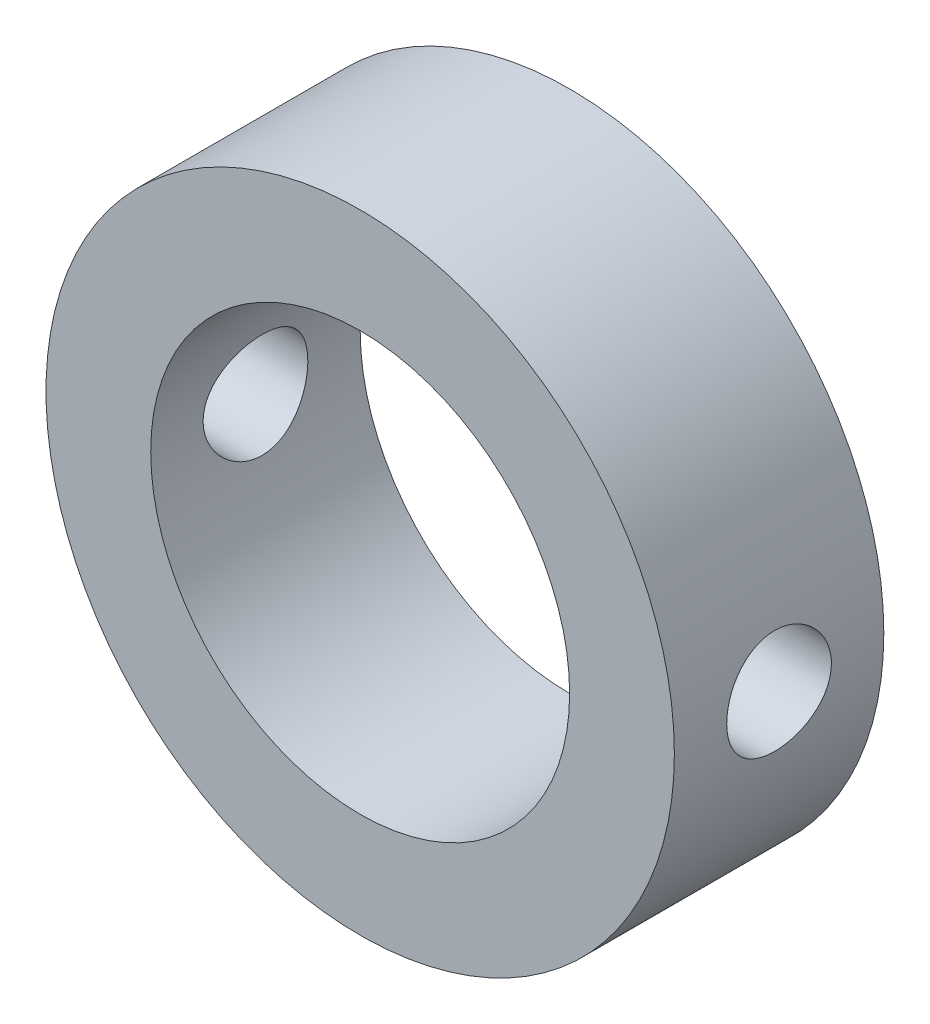
ISO-10303-21;
HEADER;
FILE_DESCRIPTION(('STEP AP214'),'2;1');
FILE_NAME('part.step','',(''),(''),'','','');
FILE_SCHEMA(('AUTOMOTIVE_DESIGN { 1 0 10303 214 1 1 1 1 }'));
ENDSEC;
DATA;
#1=APPLICATION_CONTEXT('core data for automotive mechanical design processes');
#2=APPLICATION_PROTOCOL_DEFINITION('international standard','automotive_design',2000,#1);
#3=PRODUCT_CONTEXT('',#1,'mechanical');
#4=PRODUCT('Part','Part','',(#3));
#5=PRODUCT_RELATED_PRODUCT_CATEGORY('part','',(#4));
#6=PRODUCT_DEFINITION_FORMATION('','',#4);
#7=PRODUCT_DEFINITION_CONTEXT('part definition',#1,'design');
#8=PRODUCT_DEFINITION('design','',#6,#7);
#9=PRODUCT_DEFINITION_SHAPE('','',#8);
#10=(LENGTH_UNIT() NAMED_UNIT(*) SI_UNIT(.MILLI.,.METRE.));
#11=(NAMED_UNIT(*) PLANE_ANGLE_UNIT() SI_UNIT($,.RADIAN.));
#12=(NAMED_UNIT(*) SI_UNIT($,.STERADIAN.) SOLID_ANGLE_UNIT());
#13=UNCERTAINTY_MEASURE_WITH_UNIT(LENGTH_MEASURE(1.E-05),#10,'distance_accuracy_value','');
#14=(GEOMETRIC_REPRESENTATION_CONTEXT(3) GLOBAL_UNCERTAINTY_ASSIGNED_CONTEXT((#13)) GLOBAL_UNIT_ASSIGNED_CONTEXT((#10,
#11,#12)) REPRESENTATION_CONTEXT('',''));
#15=CARTESIAN_POINT('',(0.,0.,0.));
#16=DIRECTION('',(0.,0.,1.));
#17=DIRECTION('',(1.,0.,0.));
#18=AXIS2_PLACEMENT_3D('',#15,#16,#17);
#19=CARTESIAN_POINT('',(0.,0.,8.));
#20=DIRECTION('',(0.,0.,1.));
#21=DIRECTION('',(1.,0.,0.));
#22=AXIS2_PLACEMENT_3D('',#19,#20,#21);
#23=PLANE('',#22);
#24=CARTESIAN_POINT('',(0.,0.,8.));
#25=DIRECTION('',(0.,0.,1.));
#26=DIRECTION('',(1.,0.,0.));
#27=AXIS2_PLACEMENT_3D('',#24,#25,#26);
#28=CIRCLE('',#27,12.);
#29=CARTESIAN_POINT('',(12.,0.,8.));
#30=VERTEX_POINT('',#29);
#31=EDGE_CURVE('E10',#30,#30,#28,.T.);
#32=ORIENTED_EDGE('',*,*,#31,.T.);
#33=EDGE_LOOP('',(#32));
#34=FACE_BOUND('',#33,.T.);
#35=CARTESIAN_POINT('',(0.,0.,8.));
#36=DIRECTION('',(0.,0.,1.));
#37=DIRECTION('',(1.,0.,0.));
#38=AXIS2_PLACEMENT_3D('',#35,#36,#37);
#39=CIRCLE('',#38,8.);
#40=CARTESIAN_POINT('',(8.,0.,8.));
#41=VERTEX_POINT('',#40);
#42=EDGE_CURVE('E58',#41,#41,#39,.T.);
#43=ORIENTED_EDGE('',*,*,#42,.F.);
#44=EDGE_LOOP('',(#43));
#45=FACE_BOUND('',#44,.T.);
#46=ADVANCED_FACE('F37',(#34,#45),#23,.T.);
#47=CARTESIAN_POINT('',(0.,0.,0.));
#48=DIRECTION('',(0.,0.,1.));
#49=DIRECTION('',(1.,0.,0.));
#50=AXIS2_PLACEMENT_3D('',#47,#48,#49);
#51=PLANE('',#50);
#52=CARTESIAN_POINT('',(0.,0.,0.));
#53=DIRECTION('',(0.,0.,1.));
#54=DIRECTION('',(1.,0.,0.));
#55=AXIS2_PLACEMENT_3D('',#52,#53,#54);
#56=CIRCLE('',#55,12.);
#57=CARTESIAN_POINT('',(12.,0.,0.));
#58=VERTEX_POINT('',#57);
#59=EDGE_CURVE('E52',#58,#58,#56,.T.);
#60=ORIENTED_EDGE('',*,*,#59,.F.);
#61=EDGE_LOOP('',(#60));
#62=FACE_BOUND('',#61,.T.);
#63=CARTESIAN_POINT('',(0.,0.,0.));
#64=DIRECTION('',(0.,0.,1.));
#65=DIRECTION('',(1.,0.,0.));
#66=AXIS2_PLACEMENT_3D('',#63,#64,#65);
#67=CIRCLE('',#66,8.);
#68=CARTESIAN_POINT('',(8.,0.,0.));
#69=VERTEX_POINT('',#68);
#70=EDGE_CURVE('E61',#69,#69,#67,.T.);
#71=ORIENTED_EDGE('',*,*,#70,.T.);
#72=EDGE_LOOP('',(#71));
#73=FACE_BOUND('',#72,.T.);
#74=ADVANCED_FACE('F102',(#62,#73),#51,.F.);
#75=CARTESIAN_POINT('',(0.,0.,8.));
#76=DIRECTION('',(0.,0.,-1.));
#77=DIRECTION('',(-1.,0.,0.));
#78=AXIS2_PLACEMENT_3D('',#75,#76,#77);
#79=CYLINDRICAL_SURFACE('',#78,12.);
#80=CARTESIAN_POINT('',(-12.,0.,6.));
#81=CARTESIAN_POINT('',(-11.9999980893506,-0.111512723966572,5.99999552884175));
#82=CARTESIAN_POINT('',(-11.9984294233043,-0.223086305471057,5.99064218002486));
#83=CARTESIAN_POINT('',(-11.9923227595311,-0.443104177338434,5.95349147298774));
#84=CARTESIAN_POINT('',(-11.9877820313911,-0.551545494367398,5.92567715447072));
#85=CARTESIAN_POINT('',(-11.9762405458916,-0.762083797770115,5.8524676411258));
#86=CARTESIAN_POINT('',(-11.9692418012735,-0.86418589474552,5.80708682748754));
#87=CARTESIAN_POINT('',(-11.9535538166566,-1.05931347358236,5.70007016635808));
#88=CARTESIAN_POINT('',(-11.9448647700355,-1.15233999190287,5.6384361780136));
#89=CARTESIAN_POINT('',(-11.9266665396665,-1.32757809143334,5.50003593294363));
#90=CARTESIAN_POINT('',(-11.9171509745189,-1.40969032282797,5.4231447082911));
#91=CARTESIAN_POINT('',(-11.8984210150139,-1.55991079892794,5.25668162522175));
#92=CARTESIAN_POINT('',(-11.8892066397013,-1.62801815951278,5.16710896683471));
#93=CARTESIAN_POINT('',(-11.8720605260782,-1.74869370048411,4.97714322704236));
#94=CARTESIAN_POINT('',(-11.8641370327331,-1.8011636422888,4.8766869305562));
#95=CARTESIAN_POINT('',(-11.8505583183574,-1.88844669232898,4.6682323485595));
#96=CARTESIAN_POINT('',(-11.8449029441145,-1.92326099325249,4.56023457305789));
#97=CARTESIAN_POINT('',(-11.836564294742,-1.97393150222785,4.34081578011477));
#98=CARTESIAN_POINT('',(-11.8338541478856,-1.98995922330832,4.22943541079889));
#99=CARTESIAN_POINT('',(-11.8316315114932,-2.0031333802319,4.00553577849322));
#100=CARTESIAN_POINT('',(-11.8321187956577,-2.0002811523112,3.89301659666616));
#101=CARTESIAN_POINT('',(-11.8362114309084,-1.97591607871692,3.67125771097964));
#102=CARTESIAN_POINT('',(-11.8397845865513,-1.95459590551182,3.56199615716381));
#103=CARTESIAN_POINT('',(-11.8495959616881,-1.89420251232276,3.34862294573669));
#104=CARTESIAN_POINT('',(-11.8558342725862,-1.85512868345579,3.24451146488916));
#105=CARTESIAN_POINT('',(-11.8703078346728,-1.76014179687513,3.04381694124726));
#106=CARTESIAN_POINT('',(-11.8785525368586,-1.70414873110377,2.94727247513502));
#107=CARTESIAN_POINT('',(-11.8961033473201,-1.57696961404595,2.76487647956929));
#108=CARTESIAN_POINT('',(-11.9054095412343,-1.50578233652343,2.67902581403605));
#109=CARTESIAN_POINT('',(-11.9241762230383,-1.34918576972724,2.51933913135412));
#110=CARTESIAN_POINT('',(-11.9336371938532,-1.2636111710985,2.44566518516793));
#111=CARTESIAN_POINT('',(-11.9515408111738,-1.08122819918532,2.31369778986773));
#112=CARTESIAN_POINT('',(-11.959983451118,-0.984419753525138,2.25540443985342));
#113=CARTESIAN_POINT('',(-11.9749111431433,-0.78216473293337,2.15583821829097));
#114=CARTESIAN_POINT('',(-11.9813945472596,-0.676710980451729,2.11457966453499));
#115=CARTESIAN_POINT('',(-11.9916600241013,-0.460238676482186,2.05040462780322));
#116=CARTESIAN_POINT('',(-11.9954423228038,-0.349220591343575,2.02748661042103));
#117=CARTESIAN_POINT('',(-11.9998490387415,-0.1261679210413,2.00086291323109));
#118=CARTESIAN_POINT('',(-12.0005100241023,-0.0141605897208097,1.99693474255551));
#119=CARTESIAN_POINT('',(-11.9986997953694,0.208911818311909,2.0078090755425));
#120=CARTESIAN_POINT('',(-11.9962287017929,0.319976931113631,2.02261085850699));
#121=CARTESIAN_POINT('',(-11.9884546155056,0.53732494043741,2.07033987946838));
#122=CARTESIAN_POINT('',(-11.9831688384105,0.643632694708303,2.1031569667121));
#123=CARTESIAN_POINT('',(-11.9703557156429,0.849237507888354,2.18586761455963));
#124=CARTESIAN_POINT('',(-11.9628282440962,0.948534172727775,2.23576213410822));
#125=CARTESIAN_POINT('',(-11.9462761304193,1.13826455157517,2.35172089975743));
#126=CARTESIAN_POINT('',(-11.9372388470962,1.22861220074972,2.4179241249338));
#127=CARTESIAN_POINT('',(-11.9187077391352,1.39699486840215,2.56442985230805));
#128=CARTESIAN_POINT('',(-11.9092138813724,1.47502899175727,2.64473337862133));
#129=CARTESIAN_POINT('',(-11.8907214018868,1.6173942237264,2.81815803845714));
#130=CARTESIAN_POINT('',(-11.8817289290968,1.68157500889097,2.91140333241153));
#131=CARTESIAN_POINT('',(-11.8653722382231,1.79336184823599,3.10748237531083));
#132=CARTESIAN_POINT('',(-11.8580079685282,1.84096842781586,3.210315820182));
#133=CARTESIAN_POINT('',(-11.8457876295816,1.91803066517852,3.4222317862497));
#134=CARTESIAN_POINT('',(-11.8409212344885,1.94756114603836,3.53128647602439));
#135=CARTESIAN_POINT('',(-11.8342217346821,1.98786836302262,3.75289610337741));
#136=CARTESIAN_POINT('',(-11.8323883662618,1.99864672955694,3.86545073578564));
#137=CARTESIAN_POINT('',(-11.8319738646721,2.00109829283788,4.08936413276993));
#138=CARTESIAN_POINT('',(-11.8333524520452,1.99300810890015,4.20072030286023));
#139=CARTESIAN_POINT('',(-11.8391182516298,1.95846387116548,4.42046339844061));
#140=CARTESIAN_POINT('',(-11.8435054540897,1.93200987688998,4.5288503335535));
#141=CARTESIAN_POINT('',(-11.8547788502538,1.86157959167592,4.73948674983409));
#142=CARTESIAN_POINT('',(-11.8616621377574,1.81762367248035,4.84174320804482));
#143=CARTESIAN_POINT('',(-11.8771549513777,1.71346160313273,5.03746853535588));
#144=CARTESIAN_POINT('',(-11.8857645631072,1.65325464699885,5.13093696829771));
#145=CARTESIAN_POINT('',(-11.903867632365,1.51745510749773,5.3076284664862));
#146=CARTESIAN_POINT('',(-11.9133703646104,1.44168845087492,5.39071681336022));
#147=CARTESIAN_POINT('',(-11.9321149788867,1.27728722510419,5.54308128357995));
#148=CARTESIAN_POINT('',(-11.9413568002124,1.18864969033011,5.61235421491054));
#149=CARTESIAN_POINT('',(-11.9586122371378,1.00029533571223,5.73555861455996));
#150=CARTESIAN_POINT('',(-11.9666169300248,0.900506230026256,5.78938083145036));
#151=CARTESIAN_POINT('',(-11.9804093408142,0.693210455503186,5.87941558768794));
#152=CARTESIAN_POINT('',(-11.9861992654199,0.585711595864009,5.91564566486376));
#153=CARTESIAN_POINT('',(-11.9936463266636,0.398162648036321,5.96160421930133));
#154=CARTESIAN_POINT('',(-11.9960162181869,0.319247064238758,5.97597957569277));
#155=CARTESIAN_POINT('',(-11.999193727889,0.160231448255847,5.9951789902758));
#156=CARTESIAN_POINT('',(-12.0000013729651,0.0801314364867954,6.00000321290989));
#157=CARTESIAN_POINT('',(-12.,0.,6.));
#158=B_SPLINE_CURVE_WITH_KNOTS('',3,(#80,#81,#82,#83,#84,#85,#86,#87,#88,#89,#90,#91,#92,#93,
#94,#95,#96,#97,#98,#99,#100,#101,#102,#103,#104,#105,#106,#107,#108,#109,#110,#111,#112,#113,
#114,#115,#116,#117,#118,#119,#120,#121,#122,#123,#124,#125,#126,#127,#128,#129,#130,#131,#132,
#133,#134,#135,#136,#137,#138,#139,#140,#141,#142,#143,#144,#145,#146,#147,#148,#149,#150,#151,
#152,#153,#154,#155,#156,#157),.UNSPECIFIED.,.T.,.F.,(4,2,2,2,2,2,2,2,2,2,2,2,2,2,2,2,2,2,2,2,2,
2,2,2,2,2,2,2,2,2,2,2,2,2,2,2,2,2,4),(0.,0.334245267950808,0.668798036556336,1.00307749362022,
1.33731873013983,1.67441992849866,2.01154240135885,2.35074016659072,2.68991501500945,
3.02596861682739,3.36199843456709,3.69456417408327,4.02714132020305,4.36131645306046,
4.69551856544459,5.03386215929061,5.37220793308678,5.71083751132723,6.04943875616919,
6.38406306793118,6.71867450428688,7.05126245605132,7.38386908660853,7.71941460501619,
8.05498450443426,8.39403057606095,8.73306589900754,9.07068817873417,9.40828110229294,
9.7416632761816,10.0750443695051,10.4080385458098,10.7410492402347,11.0780110735471,
11.4150506710318,11.7544178528576,12.0934460170406,12.3336339853121,12.5738178182157),.UNSPECIFIED.);
#159=CARTESIAN_POINT('',(-12.,0.,6.));
#160=VERTEX_POINT('',#159);
#161=EDGE_CURVE('E88',#160,#160,#158,.T.);
#162=ORIENTED_EDGE('',*,*,#161,.T.);
#163=EDGE_LOOP('',(#162));
#164=FACE_BOUND('',#163,.T.);
#165=CARTESIAN_POINT('',(12.,0.,2.));
#166=CARTESIAN_POINT('',(11.9999980893506,-0.111512723966572,2.00000447115825));
#167=CARTESIAN_POINT('',(11.9984294233043,-0.223086305471057,2.00935781997514));
#168=CARTESIAN_POINT('',(11.9923227595311,-0.443104177338434,2.04650852701226));
#169=CARTESIAN_POINT('',(11.9877820313911,-0.551545494367398,2.07432284552928));
#170=CARTESIAN_POINT('',(11.9762405458916,-0.762083797770115,2.1475323588742));
#171=CARTESIAN_POINT('',(11.9692418012735,-0.864185894745521,2.19291317251246));
#172=CARTESIAN_POINT('',(11.9535538166566,-1.05931347358236,2.29992983364192));
#173=CARTESIAN_POINT('',(11.9448647700355,-1.15233999190287,2.3615638219864));
#174=CARTESIAN_POINT('',(11.9266665396665,-1.32757809143334,2.49996406705637));
#175=CARTESIAN_POINT('',(11.9171509745189,-1.40969032282797,2.5768552917089));
#176=CARTESIAN_POINT('',(11.8984210150139,-1.55991079892794,2.74331837477825));
#177=CARTESIAN_POINT('',(11.8892066397013,-1.62801815951278,2.83289103316529));
#178=CARTESIAN_POINT('',(11.8720605260782,-1.74869370048411,3.02285677295764));
#179=CARTESIAN_POINT('',(11.8641370327331,-1.8011636422888,3.1233130694438));
#180=CARTESIAN_POINT('',(11.8505583183574,-1.88844669232898,3.3317676514405));
#181=CARTESIAN_POINT('',(11.8449029441145,-1.92326099325249,3.43976542694211));
#182=CARTESIAN_POINT('',(11.836564294742,-1.97393150222785,3.65918421988523));
#183=CARTESIAN_POINT('',(11.8338541478856,-1.98995922330832,3.77056458920111));
#184=CARTESIAN_POINT('',(11.8316315114932,-2.0031333802319,3.99446422150678));
#185=CARTESIAN_POINT('',(11.8321187956577,-2.0002811523112,4.10698340333384));
#186=CARTESIAN_POINT('',(11.8362114309084,-1.97591607871692,4.32874228902036));
#187=CARTESIAN_POINT('',(11.8397845865513,-1.95459590551182,4.43800384283619));
#188=CARTESIAN_POINT('',(11.8495959616881,-1.89420251232276,4.65137705426331));
#189=CARTESIAN_POINT('',(11.8558342725862,-1.85512868345579,4.75548853511084));
#190=CARTESIAN_POINT('',(11.8703078346728,-1.76014179687513,4.95618305875274));
#191=CARTESIAN_POINT('',(11.8785525368586,-1.70414873110377,5.05272752486498));
#192=CARTESIAN_POINT('',(11.8961033473201,-1.57696961404595,5.23512352043071));
#193=CARTESIAN_POINT('',(11.9054095412343,-1.50578233652343,5.32097418596395));
#194=CARTESIAN_POINT('',(11.9241762230383,-1.34918576972724,5.48066086864588));
#195=CARTESIAN_POINT('',(11.9336371938532,-1.2636111710985,5.55433481483207));
#196=CARTESIAN_POINT('',(11.9515408111738,-1.08122819918532,5.68630221013227));
#197=CARTESIAN_POINT('',(11.959983451118,-0.984419753525138,5.74459556014658));
#198=CARTESIAN_POINT('',(11.9749111431433,-0.782164732933369,5.84416178170903));
#199=CARTESIAN_POINT('',(11.9813945472596,-0.676710980451729,5.885420335465));
#200=CARTESIAN_POINT('',(11.9916600241013,-0.460238676482184,5.94959537219678));
#201=CARTESIAN_POINT('',(11.9954423228038,-0.349220591343574,5.97251338957897));
#202=CARTESIAN_POINT('',(11.9998490387415,-0.126167921041298,5.99913708676891));
#203=CARTESIAN_POINT('',(12.0005100241023,-0.0141605897208083,6.00306525744449));
#204=CARTESIAN_POINT('',(11.9986997953694,0.208911818311911,5.9921909244575));
#205=CARTESIAN_POINT('',(11.9962287017929,0.319976931113632,5.97738914149301));
#206=CARTESIAN_POINT('',(11.9884546155056,0.537324940437412,5.92966012053162));
#207=CARTESIAN_POINT('',(11.9831688384105,0.643632694708305,5.8968430332879));
#208=CARTESIAN_POINT('',(11.9703557156429,0.849237507888355,5.81413238544037));
#209=CARTESIAN_POINT('',(11.9628282440962,0.948534172727776,5.76423786589178));
#210=CARTESIAN_POINT('',(11.9462761304193,1.13826455157517,5.64827910024257));
#211=CARTESIAN_POINT('',(11.9372388470962,1.22861220074972,5.5820758750662));
#212=CARTESIAN_POINT('',(11.9187077391352,1.39699486840215,5.43557014769195));
#213=CARTESIAN_POINT('',(11.9092138813724,1.47502899175727,5.35526662137866));
#214=CARTESIAN_POINT('',(11.8907214018868,1.6173942237264,5.18184196154286));
#215=CARTESIAN_POINT('',(11.8817289290968,1.68157500889097,5.08859666758847));
#216=CARTESIAN_POINT('',(11.8653722382231,1.79336184823599,4.89251762468917));
#217=CARTESIAN_POINT('',(11.8580079685282,1.84096842781586,4.789684179818));
#218=CARTESIAN_POINT('',(11.8457876295816,1.91803066517852,4.57776821375029));
#219=CARTESIAN_POINT('',(11.8409212344885,1.94756114603836,4.46871352397561));
#220=CARTESIAN_POINT('',(11.8342217346821,1.98786836302262,4.24710389662259));
#221=CARTESIAN_POINT('',(11.8323883662618,1.99864672955694,4.13454926421436));
#222=CARTESIAN_POINT('',(11.8319738646721,2.00109829283788,3.91063586723007));
#223=CARTESIAN_POINT('',(11.8333524520452,1.99300810890015,3.79927969713977));
#224=CARTESIAN_POINT('',(11.8391182516298,1.95846387116548,3.57953660155939));
#225=CARTESIAN_POINT('',(11.8435054540897,1.93200987688998,3.4711496664465));
#226=CARTESIAN_POINT('',(11.8547788502538,1.86157959167592,3.26051325016591));
#227=CARTESIAN_POINT('',(11.8616621377574,1.81762367248035,3.15825679195518));
#228=CARTESIAN_POINT('',(11.8771549513777,1.71346160313273,2.96253146464412));
#229=CARTESIAN_POINT('',(11.8857645631072,1.65325464699885,2.86906303170229));
#230=CARTESIAN_POINT('',(11.903867632365,1.51745510749772,2.6923715335138));
#231=CARTESIAN_POINT('',(11.9133703646104,1.44168845087492,2.60928318663978));
#232=CARTESIAN_POINT('',(11.9321149788867,1.27728722510418,2.45691871642005));
#233=CARTESIAN_POINT('',(11.9413568002124,1.18864969033011,2.38764578508946));
#234=CARTESIAN_POINT('',(11.9586122371378,1.00029533571222,2.26444138544004));
#235=CARTESIAN_POINT('',(11.9666169300248,0.900506230026254,2.21061916854964));
#236=CARTESIAN_POINT('',(11.9804093408142,0.693210455503184,2.12058441231206));
#237=CARTESIAN_POINT('',(11.9861992654199,0.585711595864007,2.08435433513624));
#238=CARTESIAN_POINT('',(11.9936463266636,0.398162648036319,2.03839578069867));
#239=CARTESIAN_POINT('',(11.9960162181869,0.319247064238756,2.02402042430723));
#240=CARTESIAN_POINT('',(11.999193727889,0.160231448255846,2.0048210097242));
#241=CARTESIAN_POINT('',(12.0000013729651,0.0801314364867947,1.99999678709011));
#242=CARTESIAN_POINT('',(12.,0.,2.));
#243=B_SPLINE_CURVE_WITH_KNOTS('',3,(#165,#166,#167,#168,#169,#170,#171,#172,#173,#174,#175,
#176,#177,#178,#179,#180,#181,#182,#183,#184,#185,#186,#187,#188,#189,#190,#191,#192,#193,#194,
#195,#196,#197,#198,#199,#200,#201,#202,#203,#204,#205,#206,#207,#208,#209,#210,#211,#212,#213,
#214,#215,#216,#217,#218,#219,#220,#221,#222,#223,#224,#225,#226,#227,#228,#229,#230,#231,#232,
#233,#234,#235,#236,#237,#238,#239,#240,#241,#242),.UNSPECIFIED.,.T.,.F.,(4,2,2,2,2,2,2,2,2,2,2,
2,2,2,2,2,2,2,2,2,2,2,2,2,2,2,2,2,2,2,2,2,2,2,2,2,2,2,4),(0.,0.334245267950808,
0.668798036556337,1.00307749362022,1.33731873013983,1.67441992849866,2.01154240135885,
2.35074016659072,2.68991501500945,3.02596861682739,3.36199843456709,3.69456417408327,
4.02714132020305,4.36131645306046,4.69551856544459,5.03386215929061,5.37220793308678,
5.71083751132723,6.04943875616919,6.38406306793118,6.71867450428688,7.05126245605133,
7.38386908660854,7.71941460501619,8.05498450443427,8.39403057606096,8.73306589900755,
9.07068817873418,9.40828110229295,9.74166327618161,10.0750443695051,10.4080385458098,
10.7410492402347,11.0780110735471,11.4150506710318,11.7544178528576,12.0934460170406,
12.3336339853122,12.5738178182158),.UNSPECIFIED.);
#244=CARTESIAN_POINT('',(12.,0.,2.));
#245=VERTEX_POINT('',#244);
#246=EDGE_CURVE('E82',#245,#245,#243,.T.);
#247=ORIENTED_EDGE('',*,*,#246,.T.);
#248=EDGE_LOOP('',(#247));
#249=FACE_BOUND('',#248,.T.);
#250=ORIENTED_EDGE('',*,*,#31,.F.);
#251=EDGE_LOOP('',(#250));
#252=FACE_BOUND('',#251,.T.);
#253=ORIENTED_EDGE('',*,*,#59,.T.);
#254=EDGE_LOOP('',(#253));
#255=FACE_BOUND('',#254,.T.);
#256=ADVANCED_FACE('F39',(#164,#249,#252,#255),#79,.T.);
#257=CARTESIAN_POINT('',(0.,0.,8.));
#258=DIRECTION('',(0.,0.,-1.));
#259=DIRECTION('',(-1.,0.,0.));
#260=AXIS2_PLACEMENT_3D('',#257,#258,#259);
#261=CYLINDRICAL_SURFACE('',#260,8.);
#262=CARTESIAN_POINT('',(-8.,0.,6.));
#263=CARTESIAN_POINT('',(-7.9999981315735,-0.110501451559642,5.99999689901579));
#264=CARTESIAN_POINT('',(-7.99768770842435,-0.221037543774351,5.99081126563495));
#265=CARTESIAN_POINT('',(-7.98869485106526,-0.438941765027377,5.95436646492399));
#266=CARTESIAN_POINT('',(-7.98200993893301,-0.546308062494319,5.92709705394953));
#267=CARTESIAN_POINT('',(-7.96500835109376,-0.754694496243436,5.85541432871722));
#268=CARTESIAN_POINT('',(-7.95469603789411,-0.855722084573336,5.81102160171297));
#269=CARTESIAN_POINT('',(-7.93153791743495,-1.04889617587257,5.70642481327354));
#270=CARTESIAN_POINT('',(-7.91869202472209,-1.14104237913168,5.64622021850804));
#271=CARTESIAN_POINT('',(-7.89156551455591,-1.31573590306789,5.51039894712776));
#272=CARTESIAN_POINT('',(-7.87726276197502,-1.39807425341474,5.43451790005459));
#273=CARTESIAN_POINT('',(-7.84898160157248,-1.54899856960443,5.27006372678795));
#274=CARTESIAN_POINT('',(-7.83500323053157,-1.61758298259892,5.18148916940409));
#275=CARTESIAN_POINT('',(-7.80873034264225,-1.74003539039863,4.99253969768401));
#276=CARTESIAN_POINT('',(-7.79646392619748,-1.79366962123352,4.89200902558836));
#277=CARTESIAN_POINT('',(-7.77532659757355,-1.88319587806766,4.68300211778662));
#278=CARTESIAN_POINT('',(-7.76645514259225,-1.91909074058685,4.57452715555731));
#279=CARTESIAN_POINT('',(-7.7533396892843,-1.97140644907302,4.35500866906445));
#280=CARTESIAN_POINT('',(-7.74900654662681,-1.98820302444274,4.24406013861601));
#281=CARTESIAN_POINT('',(-7.74519149946122,-2.00301570008855,4.02084190800087));
#282=CARTESIAN_POINT('',(-7.74570880570571,-2.00103485575748,3.90857242574382));
#283=CARTESIAN_POINT('',(-7.75145607355756,-1.97864869951961,3.6887789230062));
#284=CARTESIAN_POINT('',(-7.75657150676391,-1.95869112025418,3.58120583804623));
#285=CARTESIAN_POINT('',(-7.77075612894758,-1.90163224920399,3.37098526545192));
#286=CARTESIAN_POINT('',(-7.77982559958985,-1.86452973609252,3.26833812929477));
#287=CARTESIAN_POINT('',(-7.80100151874212,-1.77385263724958,3.06968264499716));
#288=CARTESIAN_POINT('',(-7.81313769959755,-1.72011555631056,2.97375177094724));
#289=CARTESIAN_POINT('',(-7.83906281127988,-1.59780836801993,2.79210838699091));
#290=CARTESIAN_POINT('',(-7.85285203112837,-1.52923566507845,2.70639766924366));
#291=CARTESIAN_POINT('',(-7.88101174053188,-1.37688456624163,2.54506184574079));
#292=CARTESIAN_POINT('',(-7.89538759304001,-1.29272834422115,2.46979401325153));
#293=CARTESIAN_POINT('',(-7.92274620771675,-1.11281589000493,2.3343716767148));
#294=CARTESIAN_POINT('',(-7.93572892732543,-1.01705930361059,2.27421763431525));
#295=CARTESIAN_POINT('',(-7.9589030945892,-0.816154518241856,2.17059921836749));
#296=CARTESIAN_POINT('',(-7.96908480170303,-0.710975190944832,2.12719287966076));
#297=CARTESIAN_POINT('',(-7.98543889321888,-0.494501344190511,2.05877692572057));
#298=CARTESIAN_POINT('',(-7.99161204452374,-0.383207998867313,2.03376379144248));
#299=CARTESIAN_POINT('',(-7.999139990285,-0.160719960520036,2.00338991258822));
#300=CARTESIAN_POINT('',(-8.00061404677705,-0.0495956266509468,1.9975426318996));
#301=CARTESIAN_POINT('',(-7.99891739752601,0.172043833068677,2.00433200274065));
#302=CARTESIAN_POINT('',(-7.99574710989128,0.282559012859459,2.01696699039884));
#303=CARTESIAN_POINT('',(-7.98519441503143,0.498152358368655,2.05996121118851));
#304=CARTESIAN_POINT('',(-7.97787512247748,0.603286825291673,2.09005501796932));
#305=CARTESIAN_POINT('',(-7.95984942178845,0.807009723270015,2.16680944537126));
#306=CARTESIAN_POINT('',(-7.94914267159856,0.905597492043512,2.21347173908423));
#307=CARTESIAN_POINT('',(-7.92524410568414,1.0953641792398,2.3229815051663));
#308=CARTESIAN_POINT('',(-7.91201156489243,1.18638058911444,2.38610148319568));
#309=CARTESIAN_POINT('',(-7.88459345583226,1.35670215152433,2.52638654506263));
#310=CARTESIAN_POINT('',(-7.87040772335606,1.43600527863068,2.60355405282254));
#311=CARTESIAN_POINT('',(-7.84225275947695,1.58265409076364,2.77200261445928));
#312=CARTESIAN_POINT('',(-7.82829738916375,1.64965849016271,2.86358360400323));
#313=CARTESIAN_POINT('',(-7.80257171169652,1.7673476786836,3.05697684595429));
#314=CARTESIAN_POINT('',(-7.79080130756035,1.81803319221058,3.15878864394634));
#315=CARTESIAN_POINT('',(-7.77090792979553,1.90126856081239,3.3692076298841));
#316=CARTESIAN_POINT('',(-7.76276340389207,1.93392586220542,3.47777017112534));
#317=CARTESIAN_POINT('',(-7.75102325453578,1.98046087993837,3.69907951718548));
#318=CARTESIAN_POINT('',(-7.74742663626581,1.99434270330488,3.81182540137665));
#319=CARTESIAN_POINT('',(-7.74526534938609,2.00271812044533,4.03482803180694));
#320=CARTESIAN_POINT('',(-7.74655910304352,1.99775719704016,4.14506324683297));
#321=CARTESIAN_POINT('',(-7.7537054534379,1.96983637108382,4.36307185155731));
#322=CARTESIAN_POINT('',(-7.75955795855809,1.94687683024903,4.47084529068487));
#323=CARTESIAN_POINT('',(-7.77508347576963,1.88390842592373,4.68027794542054));
#324=CARTESIAN_POINT('',(-7.78473353648412,1.84400187290717,4.78196974032028));
#325=CARTESIAN_POINT('',(-7.80677007633105,1.74835321814009,4.97728717695158));
#326=CARTESIAN_POINT('',(-7.81915693494364,1.69260892004559,5.07091169758255));
#327=CARTESIAN_POINT('',(-7.84567512351349,1.56515699818285,5.25007283866936));
#328=CARTESIAN_POINT('',(-7.85984353109009,1.49307088388301,5.33533476456528));
#329=CARTESIAN_POINT('',(-7.88810702995047,1.33571916158632,5.49272939306054));
#330=CARTESIAN_POINT('',(-7.90220210302746,1.2504504283482,5.56485897348396));
#331=CARTESIAN_POINT('',(-7.92903540863551,1.06729011560345,5.69521507808614));
#332=CARTESIAN_POINT('',(-7.94174444487824,0.96919789642185,5.75316615156211));
#333=CARTESIAN_POINT('',(-7.96406566633491,0.764354746013969,5.85166328392071));
#334=CARTESIAN_POINT('',(-7.97368006933042,0.65761008458232,5.89222181419805));
#335=CARTESIAN_POINT('',(-7.98730746087389,0.459213670991296,5.94876244043954));
#336=CARTESIAN_POINT('',(-7.9920344673692,0.368506894544092,5.96793499073791));
#337=CARTESIAN_POINT('',(-7.99838140309264,0.185208095381712,5.99355459149592));
#338=CARTESIAN_POINT('',(-8.00000156601192,0.0926162149901555,6.00000259907373));
#339=CARTESIAN_POINT('',(-8.,0.,6.));
#340=B_SPLINE_CURVE_WITH_KNOTS('',3,(#262,#263,#264,#265,#266,#267,#268,#269,#270,#271,#272,
#273,#274,#275,#276,#277,#278,#279,#280,#281,#282,#283,#284,#285,#286,#287,#288,#289,#290,#291,
#292,#293,#294,#295,#296,#297,#298,#299,#300,#301,#302,#303,#304,#305,#306,#307,#308,#309,#310,
#311,#312,#313,#314,#315,#316,#317,#318,#319,#320,#321,#322,#323,#324,#325,#326,#327,#328,#329,
#330,#331,#332,#333,#334,#335,#336,#337,#338,#339),.UNSPECIFIED.,.T.,.F.,(4,2,2,2,2,2,2,2,2,2,2,
2,2,2,2,2,2,2,2,2,2,2,2,2,2,2,2,2,2,2,2,2,2,2,2,2,2,2,4),(0.,0.33116494996252,0.662517650351866,
0.993473203048141,1.32443992022577,1.66152580582852,1.99864972773416,2.34078196727743,
2.68285948225825,3.01808393468093,3.3532538415469,3.68029996013785,4.00736937959146,
4.337740371696,4.66816921119311,5.00802001296453,5.34788119415424,5.6889097201658,
6.02987298255951,6.36211078603463,6.69431868154751,7.02160366023144,7.34892169767481,
7.68204783424897,8.01523150681786,8.35659345610395,8.69794025003772,9.03723006156476,
9.37644564340971,9.70591707202578,10.0353818794581,10.3628853408369,10.6904342418696,
11.0265276855097,11.3627009303165,11.7049624733721,12.0469781843289,12.3245632392729,
12.6021274139515),.UNSPECIFIED.);
#341=CARTESIAN_POINT('',(-8.,0.,6.));
#342=VERTEX_POINT('',#341);
#343=EDGE_CURVE('E42',#342,#342,#340,.T.);
#344=ORIENTED_EDGE('',*,*,#343,.F.);
#345=EDGE_LOOP('',(#344));
#346=FACE_BOUND('',#345,.T.);
#347=CARTESIAN_POINT('',(8.,0.,2.));
#348=CARTESIAN_POINT('',(7.9999981315735,-0.110501451559641,2.00000310098421));
#349=CARTESIAN_POINT('',(7.99768770842435,-0.221037543774351,2.00918873436505));
#350=CARTESIAN_POINT('',(7.98869485106526,-0.438941765027377,2.04563353507601));
#351=CARTESIAN_POINT('',(7.98200993893301,-0.546308062494319,2.07290294605047));
#352=CARTESIAN_POINT('',(7.96500835109376,-0.754694496243436,2.14458567128278));
#353=CARTESIAN_POINT('',(7.95469603789411,-0.855722084573336,2.18897839828703));
#354=CARTESIAN_POINT('',(7.93153791743495,-1.04889617587257,2.29357518672646));
#355=CARTESIAN_POINT('',(7.91869202472209,-1.14104237913168,2.35377978149196));
#356=CARTESIAN_POINT('',(7.89156551455591,-1.31573590306789,2.48960105287224));
#357=CARTESIAN_POINT('',(7.87726276197502,-1.39807425341474,2.56548209994541));
#358=CARTESIAN_POINT('',(7.84898160157248,-1.54899856960443,2.72993627321205));
#359=CARTESIAN_POINT('',(7.83500323053157,-1.61758298259892,2.81851083059591));
#360=CARTESIAN_POINT('',(7.80873034264225,-1.74003539039863,3.00746030231599));
#361=CARTESIAN_POINT('',(7.79646392619748,-1.79366962123352,3.10799097441164));
#362=CARTESIAN_POINT('',(7.77532659757355,-1.88319587806766,3.31699788221338));
#363=CARTESIAN_POINT('',(7.76645514259225,-1.91909074058685,3.42547284444269));
#364=CARTESIAN_POINT('',(7.7533396892843,-1.97140644907302,3.64499133093555));
#365=CARTESIAN_POINT('',(7.74900654662681,-1.98820302444274,3.75593986138399));
#366=CARTESIAN_POINT('',(7.74519149946122,-2.00301570008855,3.97915809199913));
#367=CARTESIAN_POINT('',(7.74570880570571,-2.00103485575748,4.09142757425618));
#368=CARTESIAN_POINT('',(7.75145607355756,-1.97864869951961,4.3112210769938));
#369=CARTESIAN_POINT('',(7.75657150676391,-1.95869112025418,4.41879416195377));
#370=CARTESIAN_POINT('',(7.77075612894758,-1.90163224920399,4.62901473454808));
#371=CARTESIAN_POINT('',(7.77982559958985,-1.86452973609252,4.73166187070523));
#372=CARTESIAN_POINT('',(7.80100151874212,-1.77385263724958,4.93031735500284));
#373=CARTESIAN_POINT('',(7.81313769959755,-1.72011555631056,5.02624822905276));
#374=CARTESIAN_POINT('',(7.83906281127988,-1.59780836801993,5.20789161300909));
#375=CARTESIAN_POINT('',(7.85285203112837,-1.52923566507845,5.29360233075634));
#376=CARTESIAN_POINT('',(7.88101174053188,-1.37688456624163,5.45493815425921));
#377=CARTESIAN_POINT('',(7.89538759304001,-1.29272834422115,5.53020598674847));
#378=CARTESIAN_POINT('',(7.92274620771675,-1.11281589000493,5.66562832328521));
#379=CARTESIAN_POINT('',(7.93572892732543,-1.01705930361059,5.72578236568475));
#380=CARTESIAN_POINT('',(7.9589030945892,-0.816154518241855,5.82940078163251));
#381=CARTESIAN_POINT('',(7.96908480170303,-0.71097519094483,5.87280712033924));
#382=CARTESIAN_POINT('',(7.98543889321888,-0.494501344190509,5.94122307427943));
#383=CARTESIAN_POINT('',(7.99161204452374,-0.383207998867312,5.96623620855752));
#384=CARTESIAN_POINT('',(7.999139990285,-0.160719960520035,5.99661008741178));
#385=CARTESIAN_POINT('',(8.00061404677705,-0.0495956266509452,6.0024573681004));
#386=CARTESIAN_POINT('',(7.99891739752601,0.172043833068679,5.99566799725935));
#387=CARTESIAN_POINT('',(7.99574710989128,0.282559012859461,5.98303300960116));
#388=CARTESIAN_POINT('',(7.98519441503143,0.498152358368656,5.94003878881149));
#389=CARTESIAN_POINT('',(7.97787512247748,0.603286825291673,5.90994498203068));
#390=CARTESIAN_POINT('',(7.95984942178845,0.807009723270015,5.83319055462874));
#391=CARTESIAN_POINT('',(7.94914267159856,0.905597492043513,5.78652826091577));
#392=CARTESIAN_POINT('',(7.92524410568414,1.0953641792398,5.6770184948337));
#393=CARTESIAN_POINT('',(7.91201156489243,1.18638058911444,5.61389851680432));
#394=CARTESIAN_POINT('',(7.88459345583226,1.35670215152433,5.47361345493737));
#395=CARTESIAN_POINT('',(7.87040772335606,1.43600527863068,5.39644594717746));
#396=CARTESIAN_POINT('',(7.84225275947695,1.58265409076364,5.22799738554071));
#397=CARTESIAN_POINT('',(7.82829738916375,1.64965849016271,5.13641639599677));
#398=CARTESIAN_POINT('',(7.80257171169652,1.7673476786836,4.94302315404571));
#399=CARTESIAN_POINT('',(7.79080130756035,1.81803319221058,4.84121135605366));
#400=CARTESIAN_POINT('',(7.77090792979553,1.90126856081239,4.6307923701159));
#401=CARTESIAN_POINT('',(7.76276340389207,1.93392586220542,4.52222982887465));
#402=CARTESIAN_POINT('',(7.75102325453578,1.98046087993837,4.30092048281452));
#403=CARTESIAN_POINT('',(7.74742663626581,1.99434270330488,4.18817459862335));
#404=CARTESIAN_POINT('',(7.74526534938609,2.00271812044533,3.96517196819306));
#405=CARTESIAN_POINT('',(7.74655910304351,1.99775719704016,3.85493675316703));
#406=CARTESIAN_POINT('',(7.7537054534379,1.96983637108382,3.63692814844269));
#407=CARTESIAN_POINT('',(7.75955795855809,1.94687683024903,3.52915470931513));
#408=CARTESIAN_POINT('',(7.77508347576963,1.88390842592373,3.31972205457945));
#409=CARTESIAN_POINT('',(7.78473353648412,1.84400187290717,3.21803025967972));
#410=CARTESIAN_POINT('',(7.80677007633105,1.74835321814009,3.02271282304841));
#411=CARTESIAN_POINT('',(7.81915693494364,1.69260892004558,2.92908830241744));
#412=CARTESIAN_POINT('',(7.8456751235135,1.56515699818285,2.74992716133064));
#413=CARTESIAN_POINT('',(7.85984353109009,1.49307088388301,2.66466523543472));
#414=CARTESIAN_POINT('',(7.88810702995048,1.33571916158631,2.50727060693946));
#415=CARTESIAN_POINT('',(7.90220210302746,1.25045042834819,2.43514102651604));
#416=CARTESIAN_POINT('',(7.92903540863551,1.06729011560345,2.30478492191386));
#417=CARTESIAN_POINT('',(7.94174444487824,0.969197896421848,2.24683384843789));
#418=CARTESIAN_POINT('',(7.96406566633491,0.764354746013967,2.14833671607929));
#419=CARTESIAN_POINT('',(7.97368006933042,0.657610084582318,2.10777818580195));
#420=CARTESIAN_POINT('',(7.98730746087389,0.459213670991295,2.05123755956046));
#421=CARTESIAN_POINT('',(7.9920344673692,0.368506894544091,2.03206500926209));
#422=CARTESIAN_POINT('',(7.99838140309264,0.185208095381711,2.00644540850408));
#423=CARTESIAN_POINT('',(8.00000156601192,0.0926162149901549,1.99999740092626));
#424=CARTESIAN_POINT('',(8.,0.,2.));
#425=B_SPLINE_CURVE_WITH_KNOTS('',3,(#347,#348,#349,#350,#351,#352,#353,#354,#355,#356,#357,
#358,#359,#360,#361,#362,#363,#364,#365,#366,#367,#368,#369,#370,#371,#372,#373,#374,#375,#376,
#377,#378,#379,#380,#381,#382,#383,#384,#385,#386,#387,#388,#389,#390,#391,#392,#393,#394,#395,
#396,#397,#398,#399,#400,#401,#402,#403,#404,#405,#406,#407,#408,#409,#410,#411,#412,#413,#414,
#415,#416,#417,#418,#419,#420,#421,#422,#423,#424),.UNSPECIFIED.,.T.,.F.,(4,2,2,2,2,2,2,2,2,2,2,
2,2,2,2,2,2,2,2,2,2,2,2,2,2,2,2,2,2,2,2,2,2,2,2,2,2,2,4),(0.,0.33116494996252,0.662517650351866,
0.993473203048141,1.32443992022577,1.66152580582852,1.99864972773416,2.34078196727742,
2.68285948225824,3.01808393468093,3.3532538415469,3.68029996013785,4.00736937959146,
4.337740371696,4.66816921119311,5.00802001296454,5.34788119415424,5.6889097201658,
6.02987298255951,6.36211078603463,6.69431868154751,7.02160366023144,7.34892169767482,
7.68204783424897,8.01523150681786,8.35659345610396,8.69794025003772,9.03723006156476,
9.37644564340972,9.70591707202578,10.0353818794581,10.3628853408369,10.6904342418696,
11.0265276855098,11.3627009303165,11.7049624733721,12.0469781843289,12.3245632392729,
12.6021274139515),.UNSPECIFIED.);
#426=CARTESIAN_POINT('',(8.,0.,2.));
#427=VERTEX_POINT('',#426);
#428=EDGE_CURVE('E63',#427,#427,#425,.T.);
#429=ORIENTED_EDGE('',*,*,#428,.F.);
#430=EDGE_LOOP('',(#429));
#431=FACE_BOUND('',#430,.T.);
#432=ORIENTED_EDGE('',*,*,#42,.T.);
#433=EDGE_LOOP('',(#432));
#434=FACE_BOUND('',#433,.T.);
#435=ORIENTED_EDGE('',*,*,#70,.F.);
#436=EDGE_LOOP('',(#435));
#437=FACE_BOUND('',#436,.T.);
#438=ADVANCED_FACE('F69',(#346,#431,#434,#437),#261,.F.);
#439=CARTESIAN_POINT('',(-50.,0.,4.));
#440=DIRECTION('',(1.,0.,0.));
#441=DIRECTION('',(0.,0.,-1.));
#442=AXIS2_PLACEMENT_3D('',#439,#440,#441);
#443=CYLINDRICAL_SURFACE('',#442,2.);
#444=ORIENTED_EDGE('',*,*,#428,.T.);
#445=EDGE_LOOP('',(#444));
#446=FACE_BOUND('',#445,.T.);
#447=ORIENTED_EDGE('',*,*,#246,.F.);
#448=EDGE_LOOP('',(#447));
#449=FACE_BOUND('',#448,.T.);
#450=ADVANCED_FACE('F75',(#446,#449),#443,.F.);
#451=ORIENTED_EDGE('',*,*,#343,.T.);
#452=EDGE_LOOP('',(#451));
#453=FACE_BOUND('',#452,.T.);
#454=ORIENTED_EDGE('',*,*,#161,.F.);
#455=EDGE_LOOP('',(#454));
#456=FACE_BOUND('',#455,.T.);
#457=ADVANCED_FACE('F72',(#453,#456),#443,.F.);
#458=CLOSED_SHELL('',(#46,#74,#256,#438,#450,#457));
#459=MANIFOLD_SOLID_BREP('B2',#458);
#460=ADVANCED_BREP_SHAPE_REPRESENTATION('',(#18,#459),#14);
#461=SHAPE_DEFINITION_REPRESENTATION(#9,#460);
ENDSEC;
END-ISO-10303-21;
